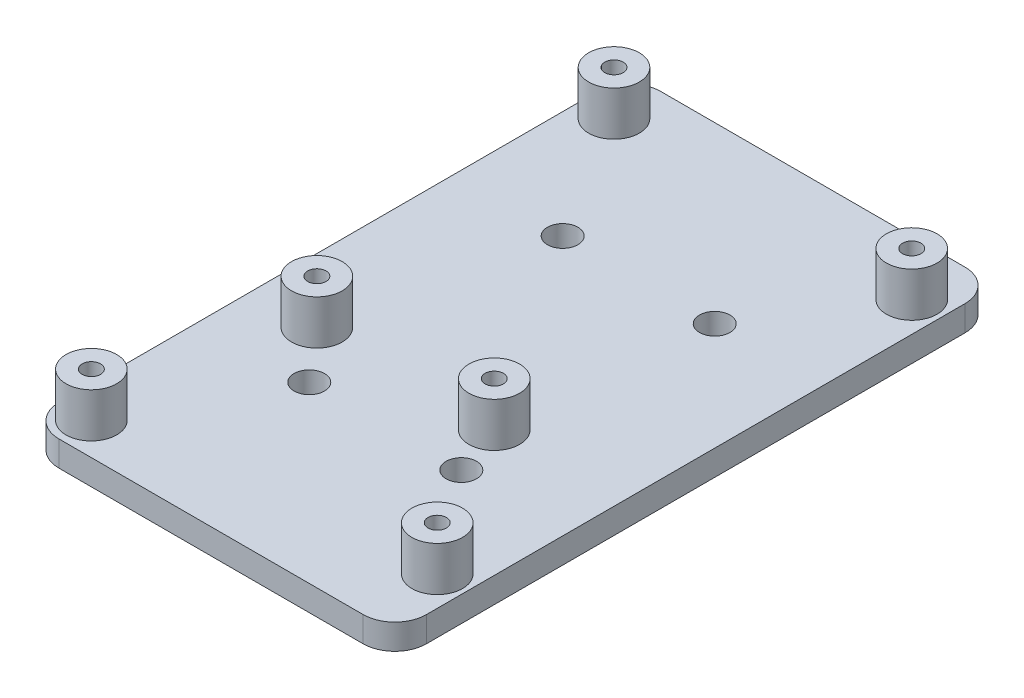
ISO-10303-21;
HEADER;
FILE_DESCRIPTION(('STEP AP214'),'2;1');
FILE_NAME('part.step','',(''),(''),'','','');
FILE_SCHEMA(('AUTOMOTIVE_DESIGN { 1 0 10303 214 1 1 1 1 }'));
ENDSEC;
DATA;
#1=APPLICATION_CONTEXT('core data for automotive mechanical design processes');
#2=APPLICATION_PROTOCOL_DEFINITION('international standard','automotive_design',2000,#1);
#3=PRODUCT_CONTEXT('',#1,'mechanical');
#4=PRODUCT('Part','Part','',(#3));
#5=PRODUCT_RELATED_PRODUCT_CATEGORY('part','',(#4));
#6=PRODUCT_DEFINITION_FORMATION('','',#4);
#7=PRODUCT_DEFINITION_CONTEXT('part definition',#1,'design');
#8=PRODUCT_DEFINITION('design','',#6,#7);
#9=PRODUCT_DEFINITION_SHAPE('','',#8);
#10=(LENGTH_UNIT() NAMED_UNIT(*) SI_UNIT(.MILLI.,.METRE.));
#11=(NAMED_UNIT(*) PLANE_ANGLE_UNIT() SI_UNIT($,.RADIAN.));
#12=(NAMED_UNIT(*) SI_UNIT($,.STERADIAN.) SOLID_ANGLE_UNIT());
#13=UNCERTAINTY_MEASURE_WITH_UNIT(LENGTH_MEASURE(1.E-05),#10,'distance_accuracy_value','');
#14=(GEOMETRIC_REPRESENTATION_CONTEXT(3) GLOBAL_UNCERTAINTY_ASSIGNED_CONTEXT((#13)) GLOBAL_UNIT_ASSIGNED_CONTEXT((#10,
#11,#12)) REPRESENTATION_CONTEXT('',''));
#15=CARTESIAN_POINT('',(0.,0.,0.));
#16=DIRECTION('',(0.,0.,1.));
#17=DIRECTION('',(1.,0.,0.));
#18=AXIS2_PLACEMENT_3D('',#15,#16,#17);
#19=CARTESIAN_POINT('',(29.,4.,-47.5));
#20=DIRECTION('',(-1.,0.,0.));
#21=DIRECTION('',(0.,0.,1.));
#22=AXIS2_PLACEMENT_3D('',#19,#20,#21);
#23=PLANE('',#22);
#24=DIRECTION('',(0.,0.,-1.));
#25=VECTOR('',#24,1.);
#26=CARTESIAN_POINT('',(29.,4.,-47.5));
#27=LINE('',#26,#25);
#28=CARTESIAN_POINT('',(29.,4.,42.5));
#29=VERTEX_POINT('',#28);
#30=CARTESIAN_POINT('',(29.,4.,-42.5));
#31=VERTEX_POINT('',#30);
#32=EDGE_CURVE('E118',#29,#31,#27,.T.);
#33=ORIENTED_EDGE('',*,*,#32,.F.);
#34=DIRECTION('',(0.,-1.,0.));
#35=VECTOR('',#34,1.);
#36=CARTESIAN_POINT('',(29.,4.,42.5));
#37=LINE('',#36,#35);
#38=CARTESIAN_POINT('',(29.,0.,42.5));
#39=VERTEX_POINT('',#38);
#40=EDGE_CURVE('E103',#29,#39,#37,.T.);
#41=ORIENTED_EDGE('',*,*,#40,.T.);
#42=DIRECTION('',(0.,0.,-1.));
#43=VECTOR('',#42,1.);
#44=CARTESIAN_POINT('',(29.,0.,-47.5));
#45=LINE('',#44,#43);
#46=CARTESIAN_POINT('',(29.,0.,-42.5));
#47=VERTEX_POINT('',#46);
#48=EDGE_CURVE('E115',#39,#47,#45,.T.);
#49=ORIENTED_EDGE('',*,*,#48,.T.);
#50=DIRECTION('',(0.,-1.,0.));
#51=VECTOR('',#50,1.);
#52=CARTESIAN_POINT('',(29.,4.,-42.5));
#53=LINE('',#52,#51);
#54=EDGE_CURVE('E120',#47,#31,#53,.F.);
#55=ORIENTED_EDGE('',*,*,#54,.T.);
#56=EDGE_LOOP('',(#33,#41,#49,#55));
#57=FACE_BOUND('',#56,.T.);
#58=ADVANCED_FACE('F33',(#57),#23,.F.);
#59=CARTESIAN_POINT('',(-29.,4.,-47.5));
#60=DIRECTION('',(0.,0.,1.));
#61=DIRECTION('',(1.,0.,0.));
#62=AXIS2_PLACEMENT_3D('',#59,#60,#61);
#63=PLANE('',#62);
#64=DIRECTION('',(-1.,0.,0.));
#65=VECTOR('',#64,1.);
#66=CARTESIAN_POINT('',(-29.,0.,-47.5));
#67=LINE('',#66,#65);
#68=CARTESIAN_POINT('',(24.,0.,-47.5));
#69=VERTEX_POINT('',#68);
#70=CARTESIAN_POINT('',(-24.,0.,-47.5));
#71=VERTEX_POINT('',#70);
#72=EDGE_CURVE('E124',#69,#71,#67,.T.);
#73=ORIENTED_EDGE('',*,*,#72,.T.);
#74=DIRECTION('',(0.,-1.,0.));
#75=VECTOR('',#74,1.);
#76=CARTESIAN_POINT('',(-24.,4.,-47.5));
#77=LINE('',#76,#75);
#78=CARTESIAN_POINT('',(-24.,4.,-47.5));
#79=VERTEX_POINT('',#78);
#80=EDGE_CURVE('E11',#71,#79,#77,.F.);
#81=ORIENTED_EDGE('',*,*,#80,.T.);
#82=DIRECTION('',(-1.,0.,0.));
#83=VECTOR('',#82,1.);
#84=CARTESIAN_POINT('',(-29.,4.,-47.5));
#85=LINE('',#84,#83);
#86=CARTESIAN_POINT('',(24.,4.,-47.5));
#87=VERTEX_POINT('',#86);
#88=EDGE_CURVE('E182',#87,#79,#85,.T.);
#89=ORIENTED_EDGE('',*,*,#88,.F.);
#90=DIRECTION('',(0.,-1.,0.));
#91=VECTOR('',#90,1.);
#92=CARTESIAN_POINT('',(24.,4.,-47.5));
#93=LINE('',#92,#91);
#94=EDGE_CURVE('E41',#87,#69,#93,.T.);
#95=ORIENTED_EDGE('',*,*,#94,.T.);
#96=EDGE_LOOP('',(#73,#81,#89,#95));
#97=FACE_BOUND('',#96,.T.);
#98=ADVANCED_FACE('F180',(#97),#63,.F.);
#99=CARTESIAN_POINT('',(-29.,4.,-47.5));
#100=DIRECTION('',(1.,0.,0.));
#101=DIRECTION('',(0.,0.,-1.));
#102=AXIS2_PLACEMENT_3D('',#99,#100,#101);
#103=PLANE('',#102);
#104=DIRECTION('',(0.,0.,1.));
#105=VECTOR('',#104,1.);
#106=CARTESIAN_POINT('',(-29.,0.,-47.5));
#107=LINE('',#106,#105);
#108=CARTESIAN_POINT('',(-29.,0.,-42.5));
#109=VERTEX_POINT('',#108);
#110=CARTESIAN_POINT('',(-29.,0.,42.5));
#111=VERTEX_POINT('',#110);
#112=EDGE_CURVE('E128',#109,#111,#107,.T.);
#113=ORIENTED_EDGE('',*,*,#112,.T.);
#114=DIRECTION('',(0.,-1.,0.));
#115=VECTOR('',#114,1.);
#116=CARTESIAN_POINT('',(-29.,4.,42.5));
#117=LINE('',#116,#115);
#118=CARTESIAN_POINT('',(-29.,4.,42.5));
#119=VERTEX_POINT('',#118);
#120=EDGE_CURVE('E48',#111,#119,#117,.F.);
#121=ORIENTED_EDGE('',*,*,#120,.T.);
#122=DIRECTION('',(0.,0.,1.));
#123=VECTOR('',#122,1.);
#124=CARTESIAN_POINT('',(-29.,4.,-47.5));
#125=LINE('',#124,#123);
#126=CARTESIAN_POINT('',(-29.,4.,-42.5));
#127=VERTEX_POINT('',#126);
#128=EDGE_CURVE('E190',#127,#119,#125,.T.);
#129=ORIENTED_EDGE('',*,*,#128,.F.);
#130=DIRECTION('',(0.,-1.,0.));
#131=VECTOR('',#130,1.);
#132=CARTESIAN_POINT('',(-29.,4.,-42.5));
#133=LINE('',#132,#131);
#134=EDGE_CURVE('E173',#127,#109,#133,.T.);
#135=ORIENTED_EDGE('',*,*,#134,.T.);
#136=EDGE_LOOP('',(#113,#121,#129,#135));
#137=FACE_BOUND('',#136,.T.);
#138=ADVANCED_FACE('F189',(#137),#103,.F.);
#139=CARTESIAN_POINT('',(-29.,4.,47.5));
#140=DIRECTION('',(0.,0.,-1.));
#141=DIRECTION('',(-1.,0.,0.));
#142=AXIS2_PLACEMENT_3D('',#139,#140,#141);
#143=PLANE('',#142);
#144=DIRECTION('',(1.,0.,0.));
#145=VECTOR('',#144,1.);
#146=CARTESIAN_POINT('',(-29.,0.,47.5));
#147=LINE('',#146,#145);
#148=CARTESIAN_POINT('',(-24.,0.,47.5));
#149=VERTEX_POINT('',#148);
#150=CARTESIAN_POINT('',(24.,0.,47.5));
#151=VERTEX_POINT('',#150);
#152=EDGE_CURVE('E138',#149,#151,#147,.T.);
#153=ORIENTED_EDGE('',*,*,#152,.T.);
#154=DIRECTION('',(0.,-1.,0.));
#155=VECTOR('',#154,1.);
#156=CARTESIAN_POINT('',(24.,4.,47.5));
#157=LINE('',#156,#155);
#158=CARTESIAN_POINT('',(24.,4.,47.5));
#159=VERTEX_POINT('',#158);
#160=EDGE_CURVE('E104',#151,#159,#157,.F.);
#161=ORIENTED_EDGE('',*,*,#160,.T.);
#162=DIRECTION('',(1.,0.,0.));
#163=VECTOR('',#162,1.);
#164=CARTESIAN_POINT('',(-29.,4.,47.5));
#165=LINE('',#164,#163);
#166=CARTESIAN_POINT('',(-24.,4.,47.5));
#167=VERTEX_POINT('',#166);
#168=EDGE_CURVE('E134',#167,#159,#165,.T.);
#169=ORIENTED_EDGE('',*,*,#168,.F.);
#170=DIRECTION('',(0.,-1.,0.));
#171=VECTOR('',#170,1.);
#172=CARTESIAN_POINT('',(-24.,4.,47.5));
#173=LINE('',#172,#171);
#174=EDGE_CURVE('E109',#167,#149,#173,.T.);
#175=ORIENTED_EDGE('',*,*,#174,.T.);
#176=EDGE_LOOP('',(#153,#161,#169,#175));
#177=FACE_BOUND('',#176,.T.);
#178=ADVANCED_FACE('F312',(#177),#143,.F.);
#179=CARTESIAN_POINT('',(0.,4.,0.));
#180=DIRECTION('',(0.,1.,0.));
#181=DIRECTION('',(0.,0.,1.));
#182=AXIS2_PLACEMENT_3D('',#179,#180,#181);
#183=PLANE('',#182);
#184=CARTESIAN_POINT('',(12.,4.,20.));
#185=DIRECTION('',(0.,1.,0.));
#186=DIRECTION('',(0.,0.,1.));
#187=AXIS2_PLACEMENT_3D('',#184,#185,#186);
#188=CIRCLE('',#187,2.4);
#189=CARTESIAN_POINT('',(12.,4.,22.4));
#190=VERTEX_POINT('',#189);
#191=EDGE_CURVE('E264',#190,#190,#188,.T.);
#192=ORIENTED_EDGE('',*,*,#191,.F.);
#193=EDGE_LOOP('',(#192));
#194=FACE_BOUND('',#193,.T.);
#195=CARTESIAN_POINT('',(-12.,4.,20.));
#196=DIRECTION('',(0.,1.,0.));
#197=DIRECTION('',(0.,0.,1.));
#198=AXIS2_PLACEMENT_3D('',#195,#196,#197);
#199=CIRCLE('',#198,2.4);
#200=CARTESIAN_POINT('',(-12.,4.,22.4));
#201=VERTEX_POINT('',#200);
#202=EDGE_CURVE('E258',#201,#201,#199,.T.);
#203=ORIENTED_EDGE('',*,*,#202,.F.);
#204=EDGE_LOOP('',(#203));
#205=FACE_BOUND('',#204,.T.);
#206=CARTESIAN_POINT('',(12.,4.,-20.));
#207=DIRECTION('',(0.,1.,0.));
#208=DIRECTION('',(0.,0.,1.));
#209=AXIS2_PLACEMENT_3D('',#206,#207,#208);
#210=CIRCLE('',#209,2.4);
#211=CARTESIAN_POINT('',(12.,4.,-17.6));
#212=VERTEX_POINT('',#211);
#213=EDGE_CURVE('E252',#212,#212,#210,.T.);
#214=ORIENTED_EDGE('',*,*,#213,.F.);
#215=EDGE_LOOP('',(#214));
#216=FACE_BOUND('',#215,.T.);
#217=CARTESIAN_POINT('',(-12.,4.,-20.));
#218=DIRECTION('',(0.,1.,0.));
#219=DIRECTION('',(0.,0.,1.));
#220=AXIS2_PLACEMENT_3D('',#217,#218,#219);
#221=CIRCLE('',#220,2.4);
#222=CARTESIAN_POINT('',(-12.,4.,-17.6));
#223=VERTEX_POINT('',#222);
#224=EDGE_CURVE('E246',#223,#223,#221,.T.);
#225=ORIENTED_EDGE('',*,*,#224,.F.);
#226=EDGE_LOOP('',(#225));
#227=FACE_BOUND('',#226,.T.);
#228=CARTESIAN_POINT('',(24.3,4.,36.1));
#229=DIRECTION('',(0.,1.,0.));
#230=DIRECTION('',(0.,0.,1.));
#231=AXIS2_PLACEMENT_3D('',#228,#229,#230);
#232=CIRCLE('',#231,4.);
#233=CARTESIAN_POINT('',(24.3,4.,40.1));
#234=VERTEX_POINT('',#233);
#235=EDGE_CURVE('E238',#234,#234,#232,.T.);
#236=ORIENTED_EDGE('',*,*,#235,.F.);
#237=EDGE_LOOP('',(#236));
#238=FACE_BOUND('',#237,.T.);
#239=CARTESIAN_POINT('',(-24.,4.,42.4));
#240=DIRECTION('',(0.,1.,0.));
#241=DIRECTION('',(0.,0.,1.));
#242=AXIS2_PLACEMENT_3D('',#239,#240,#241);
#243=CIRCLE('',#242,4.);
#244=CARTESIAN_POINT('',(-24.,4.,46.4));
#245=VERTEX_POINT('',#244);
#246=EDGE_CURVE('E229',#245,#245,#243,.T.);
#247=ORIENTED_EDGE('',*,*,#246,.F.);
#248=EDGE_LOOP('',(#247));
#249=FACE_BOUND('',#248,.T.);
#250=CARTESIAN_POINT('',(9.1,4.,11.9));
#251=DIRECTION('',(0.,1.,0.));
#252=DIRECTION('',(0.,0.,1.));
#253=AXIS2_PLACEMENT_3D('',#250,#251,#252);
#254=CIRCLE('',#253,4.);
#255=CARTESIAN_POINT('',(9.1,4.,15.9));
#256=VERTEX_POINT('',#255);
#257=EDGE_CURVE('E220',#256,#256,#254,.T.);
#258=ORIENTED_EDGE('',*,*,#257,.F.);
#259=EDGE_LOOP('',(#258));
#260=FACE_BOUND('',#259,.T.);
#261=CARTESIAN_POINT('',(-18.9,4.,11.9));
#262=DIRECTION('',(0.,1.,0.));
#263=DIRECTION('',(0.,0.,1.));
#264=AXIS2_PLACEMENT_3D('',#261,#262,#263);
#265=CIRCLE('',#264,4.);
#266=CARTESIAN_POINT('',(-18.9,4.,15.9));
#267=VERTEX_POINT('',#266);
#268=EDGE_CURVE('E211',#267,#267,#265,.T.);
#269=ORIENTED_EDGE('',*,*,#268,.F.);
#270=EDGE_LOOP('',(#269));
#271=FACE_BOUND('',#270,.T.);
#272=CARTESIAN_POINT('',(24.25,4.,-38.85));
#273=DIRECTION('',(0.,1.,0.));
#274=DIRECTION('',(0.,0.,1.));
#275=AXIS2_PLACEMENT_3D('',#272,#273,#274);
#276=CIRCLE('',#275,4.);
#277=CARTESIAN_POINT('',(24.25,4.,-34.85));
#278=VERTEX_POINT('',#277);
#279=EDGE_CURVE('E202',#278,#278,#276,.T.);
#280=ORIENTED_EDGE('',*,*,#279,.F.);
#281=EDGE_LOOP('',(#280));
#282=FACE_BOUND('',#281,.T.);
#283=CARTESIAN_POINT('',(-24.,4.,-40.1));
#284=DIRECTION('',(0.,1.,0.));
#285=DIRECTION('',(0.,0.,1.));
#286=AXIS2_PLACEMENT_3D('',#283,#284,#285);
#287=CIRCLE('',#286,4.);
#288=CARTESIAN_POINT('',(-24.,4.,-36.1));
#289=VERTEX_POINT('',#288);
#290=EDGE_CURVE('E131',#289,#289,#287,.T.);
#291=ORIENTED_EDGE('',*,*,#290,.F.);
#292=EDGE_LOOP('',(#291));
#293=FACE_BOUND('',#292,.T.);
#294=ORIENTED_EDGE('',*,*,#168,.T.);
#295=CARTESIAN_POINT('',(24.,4.,42.5));
#296=DIRECTION('',(0.,1.,0.));
#297=DIRECTION('',(0.,0.,1.));
#298=AXIS2_PLACEMENT_3D('',#295,#296,#297);
#299=CIRCLE('',#298,5.);
#300=EDGE_CURVE('E171',#159,#29,#299,.T.);
#301=ORIENTED_EDGE('',*,*,#300,.T.);
#302=ORIENTED_EDGE('',*,*,#32,.T.);
#303=CARTESIAN_POINT('',(24.,4.,-42.5));
#304=DIRECTION('',(0.,1.,0.));
#305=DIRECTION('',(0.,0.,1.));
#306=AXIS2_PLACEMENT_3D('',#303,#304,#305);
#307=CIRCLE('',#306,5.);
#308=EDGE_CURVE('E166',#31,#87,#307,.T.);
#309=ORIENTED_EDGE('',*,*,#308,.T.);
#310=ORIENTED_EDGE('',*,*,#88,.T.);
#311=CARTESIAN_POINT('',(-24.,4.,-42.5));
#312=DIRECTION('',(0.,1.,0.));
#313=DIRECTION('',(0.,0.,1.));
#314=AXIS2_PLACEMENT_3D('',#311,#312,#313);
#315=CIRCLE('',#314,5.);
#316=EDGE_CURVE('E55',#79,#127,#315,.T.);
#317=ORIENTED_EDGE('',*,*,#316,.T.);
#318=ORIENTED_EDGE('',*,*,#128,.T.);
#319=CARTESIAN_POINT('',(-24.,4.,42.5));
#320=DIRECTION('',(0.,1.,0.));
#321=DIRECTION('',(0.,0.,1.));
#322=AXIS2_PLACEMENT_3D('',#319,#320,#321);
#323=CIRCLE('',#322,5.);
#324=EDGE_CURVE('E169',#119,#167,#323,.T.);
#325=ORIENTED_EDGE('',*,*,#324,.T.);
#326=EDGE_LOOP('',(#294,#301,#302,#309,#310,#317,#318,#325));
#327=FACE_BOUND('',#326,.T.);
#328=ADVANCED_FACE('F308',(#194,#205,#216,#227,#238,#249,#260,#271,#282,#293,#327),#183,.T.);
#329=CARTESIAN_POINT('',(0.,0.,0.));
#330=DIRECTION('',(0.,1.,0.));
#331=DIRECTION('',(0.,0.,1.));
#332=AXIS2_PLACEMENT_3D('',#329,#330,#331);
#333=PLANE('',#332);
#334=CARTESIAN_POINT('',(12.,0.,20.));
#335=DIRECTION('',(0.,1.,0.));
#336=DIRECTION('',(0.,0.,1.));
#337=AXIS2_PLACEMENT_3D('',#334,#335,#336);
#338=CIRCLE('',#337,2.4);
#339=CARTESIAN_POINT('',(12.,0.,22.4));
#340=VERTEX_POINT('',#339);
#341=EDGE_CURVE('E267',#340,#340,#338,.T.);
#342=ORIENTED_EDGE('',*,*,#341,.T.);
#343=EDGE_LOOP('',(#342));
#344=FACE_BOUND('',#343,.T.);
#345=CARTESIAN_POINT('',(-12.,0.,20.));
#346=DIRECTION('',(0.,1.,0.));
#347=DIRECTION('',(0.,0.,1.));
#348=AXIS2_PLACEMENT_3D('',#345,#346,#347);
#349=CIRCLE('',#348,2.4);
#350=CARTESIAN_POINT('',(-12.,0.,22.4));
#351=VERTEX_POINT('',#350);
#352=EDGE_CURVE('E261',#351,#351,#349,.T.);
#353=ORIENTED_EDGE('',*,*,#352,.T.);
#354=EDGE_LOOP('',(#353));
#355=FACE_BOUND('',#354,.T.);
#356=CARTESIAN_POINT('',(12.,0.,-20.));
#357=DIRECTION('',(0.,1.,0.));
#358=DIRECTION('',(0.,0.,1.));
#359=AXIS2_PLACEMENT_3D('',#356,#357,#358);
#360=CIRCLE('',#359,2.4);
#361=CARTESIAN_POINT('',(12.,0.,-17.6));
#362=VERTEX_POINT('',#361);
#363=EDGE_CURVE('E255',#362,#362,#360,.T.);
#364=ORIENTED_EDGE('',*,*,#363,.T.);
#365=EDGE_LOOP('',(#364));
#366=FACE_BOUND('',#365,.T.);
#367=CARTESIAN_POINT('',(-12.,0.,-20.));
#368=DIRECTION('',(0.,1.,0.));
#369=DIRECTION('',(0.,0.,1.));
#370=AXIS2_PLACEMENT_3D('',#367,#368,#369);
#371=CIRCLE('',#370,2.4);
#372=CARTESIAN_POINT('',(-12.,0.,-17.6));
#373=VERTEX_POINT('',#372);
#374=EDGE_CURVE('E249',#373,#373,#371,.T.);
#375=ORIENTED_EDGE('',*,*,#374,.T.);
#376=EDGE_LOOP('',(#375));
#377=FACE_BOUND('',#376,.T.);
#378=ORIENTED_EDGE('',*,*,#48,.F.);
#379=CARTESIAN_POINT('',(24.,0.,42.5));
#380=DIRECTION('',(0.,1.,0.));
#381=DIRECTION('',(0.,0.,1.));
#382=AXIS2_PLACEMENT_3D('',#379,#380,#381);
#383=CIRCLE('',#382,5.);
#384=EDGE_CURVE('E99',#39,#151,#383,.F.);
#385=ORIENTED_EDGE('',*,*,#384,.T.);
#386=ORIENTED_EDGE('',*,*,#152,.F.);
#387=CARTESIAN_POINT('',(-24.,0.,42.5));
#388=DIRECTION('',(0.,1.,0.));
#389=DIRECTION('',(0.,0.,1.));
#390=AXIS2_PLACEMENT_3D('',#387,#388,#389);
#391=CIRCLE('',#390,5.);
#392=EDGE_CURVE('E110',#149,#111,#391,.F.);
#393=ORIENTED_EDGE('',*,*,#392,.T.);
#394=ORIENTED_EDGE('',*,*,#112,.F.);
#395=CARTESIAN_POINT('',(-24.,0.,-42.5));
#396=DIRECTION('',(0.,1.,0.));
#397=DIRECTION('',(0.,0.,1.));
#398=AXIS2_PLACEMENT_3D('',#395,#396,#397);
#399=CIRCLE('',#398,5.);
#400=EDGE_CURVE('E160',#109,#71,#399,.F.);
#401=ORIENTED_EDGE('',*,*,#400,.T.);
#402=ORIENTED_EDGE('',*,*,#72,.F.);
#403=CARTESIAN_POINT('',(24.,0.,-42.5));
#404=DIRECTION('',(0.,1.,0.));
#405=DIRECTION('',(0.,0.,1.));
#406=AXIS2_PLACEMENT_3D('',#403,#404,#405);
#407=CIRCLE('',#406,5.);
#408=EDGE_CURVE('E119',#69,#47,#407,.F.);
#409=ORIENTED_EDGE('',*,*,#408,.T.);
#410=EDGE_LOOP('',(#378,#385,#386,#393,#394,#401,#402,#409));
#411=FACE_BOUND('',#410,.T.);
#412=ADVANCED_FACE('F122',(#344,#355,#366,#377,#411),#333,.F.);
#413=CARTESIAN_POINT('',(-24.,11.,-40.1));
#414=DIRECTION('',(0.,1.,0.));
#415=DIRECTION('',(0.,0.,1.));
#416=AXIS2_PLACEMENT_3D('',#413,#414,#415);
#417=PLANE('',#416);
#418=CARTESIAN_POINT('',(-24.,11.,-40.1));
#419=DIRECTION('',(0.,1.,0.));
#420=DIRECTION('',(0.,0.,1.));
#421=AXIS2_PLACEMENT_3D('',#418,#419,#420);
#422=CIRCLE('',#421,4.);
#423=CARTESIAN_POINT('',(-24.,11.,-36.1));
#424=VERTEX_POINT('',#423);
#425=EDGE_CURVE('E125',#424,#424,#422,.T.);
#426=ORIENTED_EDGE('',*,*,#425,.T.);
#427=EDGE_LOOP('',(#426));
#428=FACE_BOUND('',#427,.T.);
#429=CARTESIAN_POINT('',(-24.,11.,-40.1));
#430=DIRECTION('',(0.,1.,0.));
#431=DIRECTION('',(0.,0.,1.));
#432=AXIS2_PLACEMENT_3D('',#429,#430,#431);
#433=CIRCLE('',#432,1.45);
#434=CARTESIAN_POINT('',(-24.,11.,-38.65));
#435=VERTEX_POINT('',#434);
#436=EDGE_CURVE('E197',#435,#435,#433,.T.);
#437=ORIENTED_EDGE('',*,*,#436,.F.);
#438=EDGE_LOOP('',(#437));
#439=FACE_BOUND('',#438,.T.);
#440=ADVANCED_FACE('F324',(#428,#439),#417,.T.);
#441=CARTESIAN_POINT('',(-24.,11.,-40.1));
#442=DIRECTION('',(0.,-1.,0.));
#443=DIRECTION('',(0.,0.,-1.));
#444=AXIS2_PLACEMENT_3D('',#441,#442,#443);
#445=CYLINDRICAL_SURFACE('',#444,4.);
#446=ORIENTED_EDGE('',*,*,#425,.F.);
#447=EDGE_LOOP('',(#446));
#448=FACE_BOUND('',#447,.T.);
#449=ORIENTED_EDGE('',*,*,#290,.T.);
#450=EDGE_LOOP('',(#449));
#451=FACE_BOUND('',#450,.T.);
#452=ADVANCED_FACE('F326',(#448,#451),#445,.T.);
#453=CARTESIAN_POINT('',(-24.,11.,-40.1));
#454=DIRECTION('',(0.,-1.,0.));
#455=DIRECTION('',(0.,0.,-1.));
#456=AXIS2_PLACEMENT_3D('',#453,#454,#455);
#457=CYLINDRICAL_SURFACE('',#456,1.45);
#458=ORIENTED_EDGE('',*,*,#436,.T.);
#459=EDGE_LOOP('',(#458));
#460=FACE_BOUND('',#459,.T.);
#461=CARTESIAN_POINT('',(-24.,4.,-40.1));
#462=DIRECTION('',(0.,1.,0.));
#463=DIRECTION('',(0.,0.,1.));
#464=AXIS2_PLACEMENT_3D('',#461,#462,#463);
#465=CIRCLE('',#464,1.45);
#466=CARTESIAN_POINT('',(-24.,4.,-38.65));
#467=VERTEX_POINT('',#466);
#468=EDGE_CURVE('E140',#467,#467,#465,.F.);
#469=ORIENTED_EDGE('',*,*,#468,.T.);
#470=EDGE_LOOP('',(#469));
#471=FACE_BOUND('',#470,.T.);
#472=ADVANCED_FACE('F329',(#460,#471),#457,.F.);
#473=ORIENTED_EDGE('',*,*,#468,.F.);
#474=EDGE_LOOP('',(#473));
#475=FACE_BOUND('',#474,.T.);
#476=ADVANCED_FACE('F321',(#475),#183,.T.);
#477=CARTESIAN_POINT('',(24.25,11.,-38.85));
#478=DIRECTION('',(0.,1.,0.));
#479=DIRECTION('',(0.,0.,1.));
#480=AXIS2_PLACEMENT_3D('',#477,#478,#479);
#481=PLANE('',#480);
#482=CARTESIAN_POINT('',(24.25,11.,-38.85));
#483=DIRECTION('',(0.,1.,0.));
#484=DIRECTION('',(0.,0.,1.));
#485=AXIS2_PLACEMENT_3D('',#482,#483,#484);
#486=CIRCLE('',#485,4.);
#487=CARTESIAN_POINT('',(24.25,11.,-34.85));
#488=VERTEX_POINT('',#487);
#489=EDGE_CURVE('E201',#488,#488,#486,.T.);
#490=ORIENTED_EDGE('',*,*,#489,.T.);
#491=EDGE_LOOP('',(#490));
#492=FACE_BOUND('',#491,.T.);
#493=CARTESIAN_POINT('',(24.25,11.,-38.85));
#494=DIRECTION('',(0.,1.,0.));
#495=DIRECTION('',(0.,0.,1.));
#496=AXIS2_PLACEMENT_3D('',#493,#494,#495);
#497=CIRCLE('',#496,1.45);
#498=CARTESIAN_POINT('',(24.25,11.,-37.4));
#499=VERTEX_POINT('',#498);
#500=EDGE_CURVE('E205',#499,#499,#497,.T.);
#501=ORIENTED_EDGE('',*,*,#500,.F.);
#502=EDGE_LOOP('',(#501));
#503=FACE_BOUND('',#502,.T.);
#504=ADVANCED_FACE('F341',(#492,#503),#481,.T.);
#505=CARTESIAN_POINT('',(24.25,11.,-38.85));
#506=DIRECTION('',(0.,-1.,0.));
#507=DIRECTION('',(0.,0.,-1.));
#508=AXIS2_PLACEMENT_3D('',#505,#506,#507);
#509=CYLINDRICAL_SURFACE('',#508,4.);
#510=ORIENTED_EDGE('',*,*,#489,.F.);
#511=EDGE_LOOP('',(#510));
#512=FACE_BOUND('',#511,.T.);
#513=ORIENTED_EDGE('',*,*,#279,.T.);
#514=EDGE_LOOP('',(#513));
#515=FACE_BOUND('',#514,.T.);
#516=ADVANCED_FACE('F337',(#512,#515),#509,.T.);
#517=CARTESIAN_POINT('',(24.25,11.,-38.85));
#518=DIRECTION('',(0.,-1.,0.));
#519=DIRECTION('',(0.,0.,-1.));
#520=AXIS2_PLACEMENT_3D('',#517,#518,#519);
#521=CYLINDRICAL_SURFACE('',#520,1.45);
#522=ORIENTED_EDGE('',*,*,#500,.T.);
#523=EDGE_LOOP('',(#522));
#524=FACE_BOUND('',#523,.T.);
#525=CARTESIAN_POINT('',(24.25,4.,-38.85));
#526=DIRECTION('',(0.,1.,0.));
#527=DIRECTION('',(0.,0.,1.));
#528=AXIS2_PLACEMENT_3D('',#525,#526,#527);
#529=CIRCLE('',#528,1.45);
#530=CARTESIAN_POINT('',(24.25,4.,-37.4));
#531=VERTEX_POINT('',#530);
#532=EDGE_CURVE('E143',#531,#531,#529,.F.);
#533=ORIENTED_EDGE('',*,*,#532,.T.);
#534=EDGE_LOOP('',(#533));
#535=FACE_BOUND('',#534,.T.);
#536=ADVANCED_FACE('F340',(#524,#535),#521,.F.);
#537=ORIENTED_EDGE('',*,*,#532,.F.);
#538=EDGE_LOOP('',(#537));
#539=FACE_BOUND('',#538,.T.);
#540=ADVANCED_FACE('F348',(#539),#183,.T.);
#541=CARTESIAN_POINT('',(-18.9,11.,11.9));
#542=DIRECTION('',(0.,1.,0.));
#543=DIRECTION('',(0.,0.,1.));
#544=AXIS2_PLACEMENT_3D('',#541,#542,#543);
#545=PLANE('',#544);
#546=CARTESIAN_POINT('',(-18.9,11.,11.9));
#547=DIRECTION('',(0.,1.,0.));
#548=DIRECTION('',(0.,0.,1.));
#549=AXIS2_PLACEMENT_3D('',#546,#547,#548);
#550=CIRCLE('',#549,4.);
#551=CARTESIAN_POINT('',(-18.9,11.,15.9));
#552=VERTEX_POINT('',#551);
#553=EDGE_CURVE('E210',#552,#552,#550,.T.);
#554=ORIENTED_EDGE('',*,*,#553,.T.);
#555=EDGE_LOOP('',(#554));
#556=FACE_BOUND('',#555,.T.);
#557=CARTESIAN_POINT('',(-18.9,11.,11.9));
#558=DIRECTION('',(0.,1.,0.));
#559=DIRECTION('',(0.,0.,1.));
#560=AXIS2_PLACEMENT_3D('',#557,#558,#559);
#561=CIRCLE('',#560,1.45);
#562=CARTESIAN_POINT('',(-18.9,11.,13.35));
#563=VERTEX_POINT('',#562);
#564=EDGE_CURVE('E214',#563,#563,#561,.T.);
#565=ORIENTED_EDGE('',*,*,#564,.F.);
#566=EDGE_LOOP('',(#565));
#567=FACE_BOUND('',#566,.T.);
#568=ADVANCED_FACE('F354',(#556,#567),#545,.T.);
#569=CARTESIAN_POINT('',(-18.9,11.,11.9));
#570=DIRECTION('',(0.,-1.,0.));
#571=DIRECTION('',(0.,0.,-1.));
#572=AXIS2_PLACEMENT_3D('',#569,#570,#571);
#573=CYLINDRICAL_SURFACE('',#572,4.);
#574=ORIENTED_EDGE('',*,*,#553,.F.);
#575=EDGE_LOOP('',(#574));
#576=FACE_BOUND('',#575,.T.);
#577=ORIENTED_EDGE('',*,*,#268,.T.);
#578=EDGE_LOOP('',(#577));
#579=FACE_BOUND('',#578,.T.);
#580=ADVANCED_FACE('F350',(#576,#579),#573,.T.);
#581=CARTESIAN_POINT('',(-18.9,11.,11.9));
#582=DIRECTION('',(0.,-1.,0.));
#583=DIRECTION('',(0.,0.,-1.));
#584=AXIS2_PLACEMENT_3D('',#581,#582,#583);
#585=CYLINDRICAL_SURFACE('',#584,1.45);
#586=ORIENTED_EDGE('',*,*,#564,.T.);
#587=EDGE_LOOP('',(#586));
#588=FACE_BOUND('',#587,.T.);
#589=CARTESIAN_POINT('',(-18.9,4.,11.9));
#590=DIRECTION('',(0.,1.,0.));
#591=DIRECTION('',(0.,0.,1.));
#592=AXIS2_PLACEMENT_3D('',#589,#590,#591);
#593=CIRCLE('',#592,1.45);
#594=CARTESIAN_POINT('',(-18.9,4.,13.35));
#595=VERTEX_POINT('',#594);
#596=EDGE_CURVE('E146',#595,#595,#593,.F.);
#597=ORIENTED_EDGE('',*,*,#596,.T.);
#598=EDGE_LOOP('',(#597));
#599=FACE_BOUND('',#598,.T.);
#600=ADVANCED_FACE('F353',(#588,#599),#585,.F.);
#601=ORIENTED_EDGE('',*,*,#596,.F.);
#602=EDGE_LOOP('',(#601));
#603=FACE_BOUND('',#602,.T.);
#604=ADVANCED_FACE('F361',(#603),#183,.T.);
#605=CARTESIAN_POINT('',(9.1,11.,11.9));
#606=DIRECTION('',(0.,1.,0.));
#607=DIRECTION('',(0.,0.,1.));
#608=AXIS2_PLACEMENT_3D('',#605,#606,#607);
#609=PLANE('',#608);
#610=CARTESIAN_POINT('',(9.1,11.,11.9));
#611=DIRECTION('',(0.,1.,0.));
#612=DIRECTION('',(0.,0.,1.));
#613=AXIS2_PLACEMENT_3D('',#610,#611,#612);
#614=CIRCLE('',#613,4.);
#615=CARTESIAN_POINT('',(9.1,11.,15.9));
#616=VERTEX_POINT('',#615);
#617=EDGE_CURVE('E219',#616,#616,#614,.T.);
#618=ORIENTED_EDGE('',*,*,#617,.T.);
#619=EDGE_LOOP('',(#618));
#620=FACE_BOUND('',#619,.T.);
#621=CARTESIAN_POINT('',(9.1,11.,11.9));
#622=DIRECTION('',(0.,1.,0.));
#623=DIRECTION('',(0.,0.,1.));
#624=AXIS2_PLACEMENT_3D('',#621,#622,#623);
#625=CIRCLE('',#624,1.45);
#626=CARTESIAN_POINT('',(9.1,11.,13.35));
#627=VERTEX_POINT('',#626);
#628=EDGE_CURVE('E223',#627,#627,#625,.T.);
#629=ORIENTED_EDGE('',*,*,#628,.F.);
#630=EDGE_LOOP('',(#629));
#631=FACE_BOUND('',#630,.T.);
#632=ADVANCED_FACE('F367',(#620,#631),#609,.T.);
#633=CARTESIAN_POINT('',(9.1,11.,11.9));
#634=DIRECTION('',(0.,-1.,0.));
#635=DIRECTION('',(0.,0.,-1.));
#636=AXIS2_PLACEMENT_3D('',#633,#634,#635);
#637=CYLINDRICAL_SURFACE('',#636,4.);
#638=ORIENTED_EDGE('',*,*,#617,.F.);
#639=EDGE_LOOP('',(#638));
#640=FACE_BOUND('',#639,.T.);
#641=ORIENTED_EDGE('',*,*,#257,.T.);
#642=EDGE_LOOP('',(#641));
#643=FACE_BOUND('',#642,.T.);
#644=ADVANCED_FACE('F363',(#640,#643),#637,.T.);
#645=CARTESIAN_POINT('',(9.1,11.,11.9));
#646=DIRECTION('',(0.,-1.,0.));
#647=DIRECTION('',(0.,0.,-1.));
#648=AXIS2_PLACEMENT_3D('',#645,#646,#647);
#649=CYLINDRICAL_SURFACE('',#648,1.45);
#650=ORIENTED_EDGE('',*,*,#628,.T.);
#651=EDGE_LOOP('',(#650));
#652=FACE_BOUND('',#651,.T.);
#653=CARTESIAN_POINT('',(9.1,4.,11.9));
#654=DIRECTION('',(0.,1.,0.));
#655=DIRECTION('',(0.,0.,1.));
#656=AXIS2_PLACEMENT_3D('',#653,#654,#655);
#657=CIRCLE('',#656,1.45);
#658=CARTESIAN_POINT('',(9.1,4.,13.35));
#659=VERTEX_POINT('',#658);
#660=EDGE_CURVE('E149',#659,#659,#657,.F.);
#661=ORIENTED_EDGE('',*,*,#660,.T.);
#662=EDGE_LOOP('',(#661));
#663=FACE_BOUND('',#662,.T.);
#664=ADVANCED_FACE('F366',(#652,#663),#649,.F.);
#665=ORIENTED_EDGE('',*,*,#660,.F.);
#666=EDGE_LOOP('',(#665));
#667=FACE_BOUND('',#666,.T.);
#668=ADVANCED_FACE('F374',(#667),#183,.T.);
#669=CARTESIAN_POINT('',(-24.,11.,42.4));
#670=DIRECTION('',(0.,1.,0.));
#671=DIRECTION('',(0.,0.,1.));
#672=AXIS2_PLACEMENT_3D('',#669,#670,#671);
#673=PLANE('',#672);
#674=CARTESIAN_POINT('',(-24.,11.,42.4));
#675=DIRECTION('',(0.,1.,0.));
#676=DIRECTION('',(0.,0.,1.));
#677=AXIS2_PLACEMENT_3D('',#674,#675,#676);
#678=CIRCLE('',#677,4.);
#679=CARTESIAN_POINT('',(-24.,11.,46.4));
#680=VERTEX_POINT('',#679);
#681=EDGE_CURVE('E228',#680,#680,#678,.T.);
#682=ORIENTED_EDGE('',*,*,#681,.T.);
#683=EDGE_LOOP('',(#682));
#684=FACE_BOUND('',#683,.T.);
#685=CARTESIAN_POINT('',(-24.,11.,42.4));
#686=DIRECTION('',(0.,1.,0.));
#687=DIRECTION('',(0.,0.,1.));
#688=AXIS2_PLACEMENT_3D('',#685,#686,#687);
#689=CIRCLE('',#688,1.45);
#690=CARTESIAN_POINT('',(-24.,11.,43.85));
#691=VERTEX_POINT('',#690);
#692=EDGE_CURVE('E232',#691,#691,#689,.T.);
#693=ORIENTED_EDGE('',*,*,#692,.F.);
#694=EDGE_LOOP('',(#693));
#695=FACE_BOUND('',#694,.T.);
#696=ADVANCED_FACE('F380',(#684,#695),#673,.T.);
#697=CARTESIAN_POINT('',(-24.,11.,42.4));
#698=DIRECTION('',(0.,-1.,0.));
#699=DIRECTION('',(0.,0.,-1.));
#700=AXIS2_PLACEMENT_3D('',#697,#698,#699);
#701=CYLINDRICAL_SURFACE('',#700,4.);
#702=ORIENTED_EDGE('',*,*,#681,.F.);
#703=EDGE_LOOP('',(#702));
#704=FACE_BOUND('',#703,.T.);
#705=ORIENTED_EDGE('',*,*,#246,.T.);
#706=EDGE_LOOP('',(#705));
#707=FACE_BOUND('',#706,.T.);
#708=ADVANCED_FACE('F376',(#704,#707),#701,.T.);
#709=CARTESIAN_POINT('',(-24.,11.,42.4));
#710=DIRECTION('',(0.,-1.,0.));
#711=DIRECTION('',(0.,0.,-1.));
#712=AXIS2_PLACEMENT_3D('',#709,#710,#711);
#713=CYLINDRICAL_SURFACE('',#712,1.45);
#714=ORIENTED_EDGE('',*,*,#692,.T.);
#715=EDGE_LOOP('',(#714));
#716=FACE_BOUND('',#715,.T.);
#717=CARTESIAN_POINT('',(-24.,4.,42.4));
#718=DIRECTION('',(0.,1.,0.));
#719=DIRECTION('',(0.,0.,1.));
#720=AXIS2_PLACEMENT_3D('',#717,#718,#719);
#721=CIRCLE('',#720,1.45);
#722=CARTESIAN_POINT('',(-24.,4.,43.85));
#723=VERTEX_POINT('',#722);
#724=EDGE_CURVE('E152',#723,#723,#721,.F.);
#725=ORIENTED_EDGE('',*,*,#724,.T.);
#726=EDGE_LOOP('',(#725));
#727=FACE_BOUND('',#726,.T.);
#728=ADVANCED_FACE('F379',(#716,#727),#713,.F.);
#729=ORIENTED_EDGE('',*,*,#724,.F.);
#730=EDGE_LOOP('',(#729));
#731=FACE_BOUND('',#730,.T.);
#732=ADVANCED_FACE('F387',(#731),#183,.T.);
#733=CARTESIAN_POINT('',(24.3,11.,36.1));
#734=DIRECTION('',(0.,1.,0.));
#735=DIRECTION('',(0.,0.,1.));
#736=AXIS2_PLACEMENT_3D('',#733,#734,#735);
#737=PLANE('',#736);
#738=CARTESIAN_POINT('',(24.3,11.,36.1));
#739=DIRECTION('',(0.,1.,0.));
#740=DIRECTION('',(0.,0.,1.));
#741=AXIS2_PLACEMENT_3D('',#738,#739,#740);
#742=CIRCLE('',#741,4.);
#743=CARTESIAN_POINT('',(24.3,11.,40.1));
#744=VERTEX_POINT('',#743);
#745=EDGE_CURVE('E237',#744,#744,#742,.T.);
#746=ORIENTED_EDGE('',*,*,#745,.T.);
#747=EDGE_LOOP('',(#746));
#748=FACE_BOUND('',#747,.T.);
#749=CARTESIAN_POINT('',(24.3,11.,36.1));
#750=DIRECTION('',(0.,1.,0.));
#751=DIRECTION('',(0.,0.,1.));
#752=AXIS2_PLACEMENT_3D('',#749,#750,#751);
#753=CIRCLE('',#752,1.45);
#754=CARTESIAN_POINT('',(24.3,11.,37.55));
#755=VERTEX_POINT('',#754);
#756=EDGE_CURVE('E241',#755,#755,#753,.T.);
#757=ORIENTED_EDGE('',*,*,#756,.F.);
#758=EDGE_LOOP('',(#757));
#759=FACE_BOUND('',#758,.T.);
#760=ADVANCED_FACE('F393',(#748,#759),#737,.T.);
#761=CARTESIAN_POINT('',(24.3,11.,36.1));
#762=DIRECTION('',(0.,-1.,0.));
#763=DIRECTION('',(0.,0.,-1.));
#764=AXIS2_PLACEMENT_3D('',#761,#762,#763);
#765=CYLINDRICAL_SURFACE('',#764,4.);
#766=ORIENTED_EDGE('',*,*,#745,.F.);
#767=EDGE_LOOP('',(#766));
#768=FACE_BOUND('',#767,.T.);
#769=ORIENTED_EDGE('',*,*,#235,.T.);
#770=EDGE_LOOP('',(#769));
#771=FACE_BOUND('',#770,.T.);
#772=ADVANCED_FACE('F389',(#768,#771),#765,.T.);
#773=CARTESIAN_POINT('',(24.3,11.,36.1));
#774=DIRECTION('',(0.,-1.,0.));
#775=DIRECTION('',(0.,0.,-1.));
#776=AXIS2_PLACEMENT_3D('',#773,#774,#775);
#777=CYLINDRICAL_SURFACE('',#776,1.45);
#778=ORIENTED_EDGE('',*,*,#756,.T.);
#779=EDGE_LOOP('',(#778));
#780=FACE_BOUND('',#779,.T.);
#781=CARTESIAN_POINT('',(24.3,4.,36.1));
#782=DIRECTION('',(0.,1.,0.));
#783=DIRECTION('',(0.,0.,1.));
#784=AXIS2_PLACEMENT_3D('',#781,#782,#783);
#785=CIRCLE('',#784,1.45);
#786=CARTESIAN_POINT('',(24.3,4.,37.55));
#787=VERTEX_POINT('',#786);
#788=EDGE_CURVE('E155',#787,#787,#785,.F.);
#789=ORIENTED_EDGE('',*,*,#788,.T.);
#790=EDGE_LOOP('',(#789));
#791=FACE_BOUND('',#790,.T.);
#792=ADVANCED_FACE('F392',(#780,#791),#777,.F.);
#793=ORIENTED_EDGE('',*,*,#788,.F.);
#794=EDGE_LOOP('',(#793));
#795=FACE_BOUND('',#794,.T.);
#796=ADVANCED_FACE('F295',(#795),#183,.T.);
#797=CARTESIAN_POINT('',(24.,4.,42.5));
#798=DIRECTION('',(0.,-1.,0.));
#799=DIRECTION('',(0.,0.,-1.));
#800=AXIS2_PLACEMENT_3D('',#797,#798,#799);
#801=CYLINDRICAL_SURFACE('',#800,5.);
#802=ORIENTED_EDGE('',*,*,#300,.F.);
#803=ORIENTED_EDGE('',*,*,#160,.F.);
#804=ORIENTED_EDGE('',*,*,#384,.F.);
#805=ORIENTED_EDGE('',*,*,#40,.F.);
#806=EDGE_LOOP('',(#802,#803,#804,#805));
#807=FACE_BOUND('',#806,.T.);
#808=ADVANCED_FACE('F102',(#807),#801,.T.);
#809=CARTESIAN_POINT('',(-24.,4.,42.5));
#810=DIRECTION('',(0.,-1.,0.));
#811=DIRECTION('',(0.,0.,-1.));
#812=AXIS2_PLACEMENT_3D('',#809,#810,#811);
#813=CYLINDRICAL_SURFACE('',#812,5.);
#814=ORIENTED_EDGE('',*,*,#324,.F.);
#815=ORIENTED_EDGE('',*,*,#120,.F.);
#816=ORIENTED_EDGE('',*,*,#392,.F.);
#817=ORIENTED_EDGE('',*,*,#174,.F.);
#818=EDGE_LOOP('',(#814,#815,#816,#817));
#819=FACE_BOUND('',#818,.T.);
#820=ADVANCED_FACE('F294',(#819),#813,.T.);
#821=CARTESIAN_POINT('',(-24.,4.,-42.5));
#822=DIRECTION('',(0.,-1.,0.));
#823=DIRECTION('',(0.,0.,-1.));
#824=AXIS2_PLACEMENT_3D('',#821,#822,#823);
#825=CYLINDRICAL_SURFACE('',#824,5.);
#826=ORIENTED_EDGE('',*,*,#316,.F.);
#827=ORIENTED_EDGE('',*,*,#80,.F.);
#828=ORIENTED_EDGE('',*,*,#400,.F.);
#829=ORIENTED_EDGE('',*,*,#134,.F.);
#830=EDGE_LOOP('',(#826,#827,#828,#829));
#831=FACE_BOUND('',#830,.T.);
#832=ADVANCED_FACE('F188',(#831),#825,.T.);
#833=CARTESIAN_POINT('',(24.,4.,-42.5));
#834=DIRECTION('',(0.,-1.,0.));
#835=DIRECTION('',(0.,0.,-1.));
#836=AXIS2_PLACEMENT_3D('',#833,#834,#835);
#837=CYLINDRICAL_SURFACE('',#836,5.);
#838=ORIENTED_EDGE('',*,*,#308,.F.);
#839=ORIENTED_EDGE('',*,*,#54,.F.);
#840=ORIENTED_EDGE('',*,*,#408,.F.);
#841=ORIENTED_EDGE('',*,*,#94,.F.);
#842=EDGE_LOOP('',(#838,#839,#840,#841));
#843=FACE_BOUND('',#842,.T.);
#844=ADVANCED_FACE('F35',(#843),#837,.T.);
#845=CARTESIAN_POINT('',(-12.,11.001,-20.));
#846=DIRECTION('',(0.,-1.,0.));
#847=DIRECTION('',(0.,0.,-1.));
#848=AXIS2_PLACEMENT_3D('',#845,#846,#847);
#849=CYLINDRICAL_SURFACE('',#848,2.4);
#850=ORIENTED_EDGE('',*,*,#224,.T.);
#851=EDGE_LOOP('',(#850));
#852=FACE_BOUND('',#851,.T.);
#853=ORIENTED_EDGE('',*,*,#374,.F.);
#854=EDGE_LOOP('',(#853));
#855=FACE_BOUND('',#854,.T.);
#856=ADVANCED_FACE('F302',(#852,#855),#849,.F.);
#857=CARTESIAN_POINT('',(12.,11.001,-20.));
#858=DIRECTION('',(0.,-1.,0.));
#859=DIRECTION('',(0.,0.,-1.));
#860=AXIS2_PLACEMENT_3D('',#857,#858,#859);
#861=CYLINDRICAL_SURFACE('',#860,2.4);
#862=ORIENTED_EDGE('',*,*,#213,.T.);
#863=EDGE_LOOP('',(#862));
#864=FACE_BOUND('',#863,.T.);
#865=ORIENTED_EDGE('',*,*,#363,.F.);
#866=EDGE_LOOP('',(#865));
#867=FACE_BOUND('',#866,.T.);
#868=ADVANCED_FACE('F281',(#864,#867),#861,.F.);
#869=CARTESIAN_POINT('',(-12.,11.001,20.));
#870=DIRECTION('',(0.,-1.,0.));
#871=DIRECTION('',(0.,0.,-1.));
#872=AXIS2_PLACEMENT_3D('',#869,#870,#871);
#873=CYLINDRICAL_SURFACE('',#872,2.4);
#874=ORIENTED_EDGE('',*,*,#202,.T.);
#875=EDGE_LOOP('',(#874));
#876=FACE_BOUND('',#875,.T.);
#877=ORIENTED_EDGE('',*,*,#352,.F.);
#878=EDGE_LOOP('',(#877));
#879=FACE_BOUND('',#878,.T.);
#880=ADVANCED_FACE('F275',(#876,#879),#873,.F.);
#881=CARTESIAN_POINT('',(12.,11.001,20.));
#882=DIRECTION('',(0.,-1.,0.));
#883=DIRECTION('',(0.,0.,-1.));
#884=AXIS2_PLACEMENT_3D('',#881,#882,#883);
#885=CYLINDRICAL_SURFACE('',#884,2.4);
#886=ORIENTED_EDGE('',*,*,#191,.T.);
#887=EDGE_LOOP('',(#886));
#888=FACE_BOUND('',#887,.T.);
#889=ORIENTED_EDGE('',*,*,#341,.F.);
#890=EDGE_LOOP('',(#889));
#891=FACE_BOUND('',#890,.T.);
#892=ADVANCED_FACE('F273',(#888,#891),#885,.F.);
#893=CLOSED_SHELL('',(#58,#98,#138,#178,#328,#412,#440,#452,#472,#476,#504,#516,#536,#540,#568,
#580,#600,#604,#632,#644,#664,#668,#696,#708,#728,#732,#760,#772,#792,#796,#808,#820,#832,#844,
#856,#868,#880,#892));
#894=MANIFOLD_SOLID_BREP('B2',#893);
#895=ADVANCED_BREP_SHAPE_REPRESENTATION('',(#18,#894),#14);
#896=SHAPE_DEFINITION_REPRESENTATION(#9,#895);
ENDSEC;
END-ISO-10303-21;
